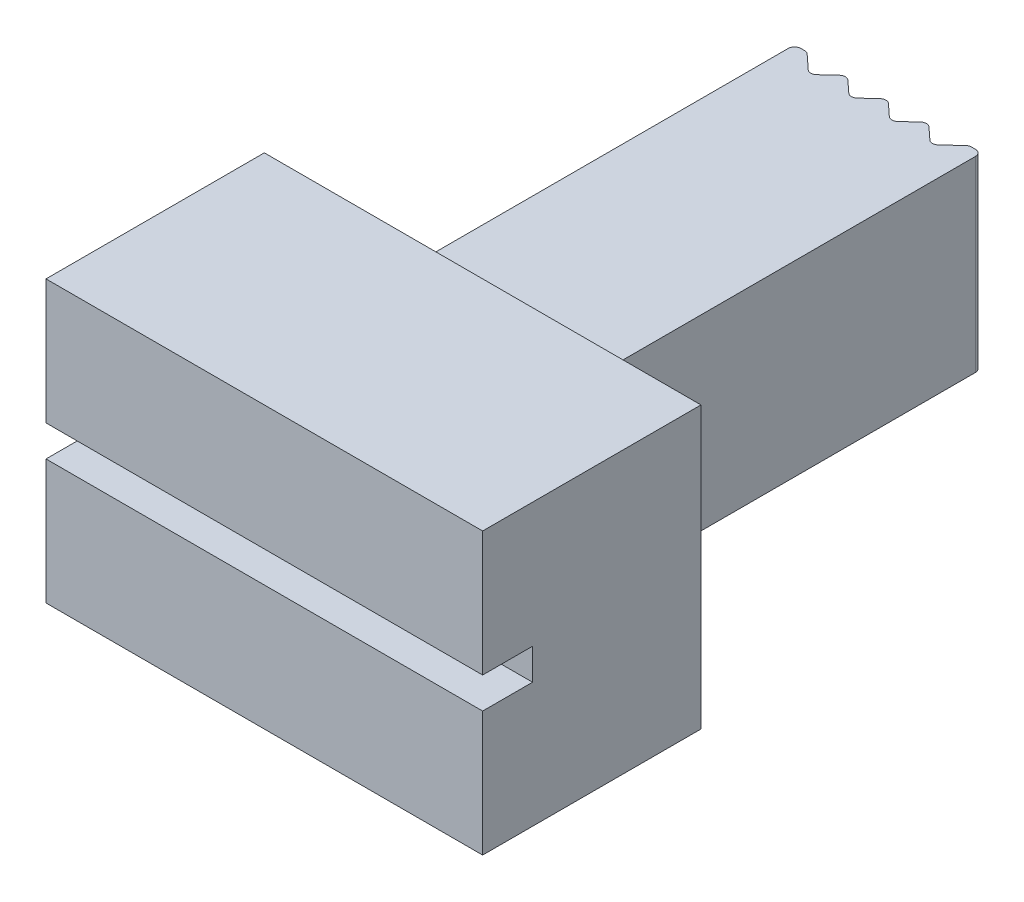
ISO-10303-21;
HEADER;
FILE_DESCRIPTION(('STEP AP214'),'2;1');
FILE_NAME('part.step','',(''),(''),'','','');
FILE_SCHEMA(('AUTOMOTIVE_DESIGN { 1 0 10303 214 1 1 1 1 }'));
ENDSEC;
DATA;
#1=APPLICATION_CONTEXT('core data for automotive mechanical design processes');
#2=APPLICATION_PROTOCOL_DEFINITION('international standard','automotive_design',2000,#1);
#3=PRODUCT_CONTEXT('',#1,'mechanical');
#4=PRODUCT('Part','Part','',(#3));
#5=PRODUCT_RELATED_PRODUCT_CATEGORY('part','',(#4));
#6=PRODUCT_DEFINITION_FORMATION('','',#4);
#7=PRODUCT_DEFINITION_CONTEXT('part definition',#1,'design');
#8=PRODUCT_DEFINITION('design','',#6,#7);
#9=PRODUCT_DEFINITION_SHAPE('','',#8);
#10=(LENGTH_UNIT() NAMED_UNIT(*) SI_UNIT(.MILLI.,.METRE.));
#11=(NAMED_UNIT(*) PLANE_ANGLE_UNIT() SI_UNIT($,.RADIAN.));
#12=(NAMED_UNIT(*) SI_UNIT($,.STERADIAN.) SOLID_ANGLE_UNIT());
#13=UNCERTAINTY_MEASURE_WITH_UNIT(LENGTH_MEASURE(1.E-05),#10,'distance_accuracy_value','');
#14=(GEOMETRIC_REPRESENTATION_CONTEXT(3) GLOBAL_UNCERTAINTY_ASSIGNED_CONTEXT((#13)) GLOBAL_UNIT_ASSIGNED_CONTEXT((#10,
#11,#12)) REPRESENTATION_CONTEXT('',''));
#15=CARTESIAN_POINT('',(0.,0.,0.));
#16=DIRECTION('',(0.,0.,1.));
#17=DIRECTION('',(1.,0.,0.));
#18=AXIS2_PLACEMENT_3D('',#15,#16,#17);
#19=CARTESIAN_POINT('',(0.,0.,-6.5));
#20=DIRECTION('',(0.,0.,-1.));
#21=DIRECTION('',(-1.,0.,0.));
#22=AXIS2_PLACEMENT_3D('',#19,#20,#21);
#23=PLANE('',#22);
#24=DIRECTION('',(-1.,0.,0.));
#25=VECTOR('',#24,1.);
#26=CARTESIAN_POINT('',(-1.5,-1.5,-6.5));
#27=LINE('',#26,#25);
#28=CARTESIAN_POINT('',(-1.33909838344129,-1.5,-6.5));
#29=VERTEX_POINT('',#28);
#30=CARTESIAN_POINT('',(-1.4,-1.5,-6.5));
#31=VERTEX_POINT('',#30);
#32=EDGE_CURVE('E296',#29,#31,#27,.T.);
#33=ORIENTED_EDGE('',*,*,#32,.T.);
#34=DIRECTION('',(0.,1.,0.));
#35=VECTOR('',#34,1.);
#36=CARTESIAN_POINT('',(-1.4,1.5,-6.5));
#37=LINE('',#36,#35);
#38=CARTESIAN_POINT('',(-1.4,1.5,-6.5));
#39=VERTEX_POINT('',#38);
#40=EDGE_CURVE('E393',#31,#39,#37,.T.);
#41=ORIENTED_EDGE('',*,*,#40,.T.);
#42=DIRECTION('',(1.,0.,0.));
#43=VECTOR('',#42,1.);
#44=CARTESIAN_POINT('',(-1.5,1.5,-6.5));
#45=LINE('',#44,#43);
#46=CARTESIAN_POINT('',(-1.33909838344128,1.5,-6.5));
#47=VERTEX_POINT('',#46);
#48=EDGE_CURVE('E301',#39,#47,#45,.T.);
#49=ORIENTED_EDGE('',*,*,#48,.T.);
#50=DIRECTION('',(0.,1.,0.));
#51=VECTOR('',#50,1.);
#52=CARTESIAN_POINT('',(-1.33909838344129,-1.5,-6.5));
#53=LINE('',#52,#51);
#54=EDGE_CURVE('E391',#47,#29,#53,.F.);
#55=ORIENTED_EDGE('',*,*,#54,.T.);
#56=EDGE_LOOP('',(#33,#41,#49,#55));
#57=FACE_BOUND('',#56,.T.);
#58=ADVANCED_FACE('F51',(#57),#23,.T.);
#59=CARTESIAN_POINT('',(0.,0.,3.5));
#60=DIRECTION('',(0.,0.,1.));
#61=DIRECTION('',(1.,0.,0.));
#62=AXIS2_PLACEMENT_3D('',#59,#60,#61);
#63=PLANE('',#62);
#64=DIRECTION('',(1.,0.,0.));
#65=VECTOR('',#64,1.);
#66=CARTESIAN_POINT('',(0.,-0.25,3.5));
#67=LINE('',#66,#65);
#68=CARTESIAN_POINT('',(-3.5,-0.25,3.5));
#69=VERTEX_POINT('',#68);
#70=CARTESIAN_POINT('',(3.5,-0.25,3.5));
#71=VERTEX_POINT('',#70);
#72=EDGE_CURVE('E355',#69,#71,#67,.T.);
#73=ORIENTED_EDGE('',*,*,#72,.F.);
#74=DIRECTION('',(0.,-1.,0.));
#75=VECTOR('',#74,1.);
#76=CARTESIAN_POINT('',(-3.5,-2.25,3.5));
#77=LINE('',#76,#75);
#78=CARTESIAN_POINT('',(-3.5,-2.25,3.5));
#79=VERTEX_POINT('',#78);
#80=EDGE_CURVE('E326',#69,#79,#77,.T.);
#81=ORIENTED_EDGE('',*,*,#80,.T.);
#82=DIRECTION('',(1.,0.,0.));
#83=VECTOR('',#82,1.);
#84=CARTESIAN_POINT('',(3.5,-2.25,3.5));
#85=LINE('',#84,#83);
#86=CARTESIAN_POINT('',(3.5,-2.25,3.5));
#87=VERTEX_POINT('',#86);
#88=EDGE_CURVE('E325',#79,#87,#85,.T.);
#89=ORIENTED_EDGE('',*,*,#88,.T.);
#90=DIRECTION('',(0.,1.,0.));
#91=VECTOR('',#90,1.);
#92=CARTESIAN_POINT('',(3.5,-2.25,3.5));
#93=LINE('',#92,#91);
#94=EDGE_CURVE('E329',#87,#71,#93,.T.);
#95=ORIENTED_EDGE('',*,*,#94,.T.);
#96=EDGE_LOOP('',(#73,#81,#89,#95));
#97=FACE_BOUND('',#96,.T.);
#98=ADVANCED_FACE('F574',(#97),#63,.T.);
#99=CARTESIAN_POINT('',(0.,0.,0.));
#100=DIRECTION('',(0.,0.,1.));
#101=DIRECTION('',(1.,0.,0.));
#102=AXIS2_PLACEMENT_3D('',#99,#100,#101);
#103=PLANE('',#102);
#104=DIRECTION('',(0.,-1.,0.));
#105=VECTOR('',#104,1.);
#106=CARTESIAN_POINT('',(-3.5,-2.25,0.));
#107=LINE('',#106,#105);
#108=CARTESIAN_POINT('',(-3.5,2.25,0.));
#109=VERTEX_POINT('',#108);
#110=CARTESIAN_POINT('',(-3.5,-2.25,0.));
#111=VERTEX_POINT('',#110);
#112=EDGE_CURVE('E322',#109,#111,#107,.T.);
#113=ORIENTED_EDGE('',*,*,#112,.F.);
#114=DIRECTION('',(-1.,0.,0.));
#115=VECTOR('',#114,1.);
#116=CARTESIAN_POINT('',(3.5,2.25,0.));
#117=LINE('',#116,#115);
#118=CARTESIAN_POINT('',(3.5,2.25,0.));
#119=VERTEX_POINT('',#118);
#120=EDGE_CURVE('E341',#119,#109,#117,.T.);
#121=ORIENTED_EDGE('',*,*,#120,.F.);
#122=DIRECTION('',(0.,1.,0.));
#123=VECTOR('',#122,1.);
#124=CARTESIAN_POINT('',(3.5,-2.25,0.));
#125=LINE('',#124,#123);
#126=CARTESIAN_POINT('',(3.5,-2.25,0.));
#127=VERTEX_POINT('',#126);
#128=EDGE_CURVE('E339',#127,#119,#125,.T.);
#129=ORIENTED_EDGE('',*,*,#128,.F.);
#130=DIRECTION('',(1.,0.,0.));
#131=VECTOR('',#130,1.);
#132=CARTESIAN_POINT('',(3.5,-2.25,0.));
#133=LINE('',#132,#131);
#134=EDGE_CURVE('E337',#111,#127,#133,.T.);
#135=ORIENTED_EDGE('',*,*,#134,.F.);
#136=EDGE_LOOP('',(#113,#121,#129,#135));
#137=FACE_BOUND('',#136,.T.);
#138=DIRECTION('',(0.,-1.,0.));
#139=VECTOR('',#138,1.);
#140=CARTESIAN_POINT('',(1.5,-1.5,0.));
#141=LINE('',#140,#139);
#142=CARTESIAN_POINT('',(1.5,1.5,0.));
#143=VERTEX_POINT('',#142);
#144=CARTESIAN_POINT('',(1.5,-1.5,0.));
#145=VERTEX_POINT('',#144);
#146=EDGE_CURVE('E294',#143,#145,#141,.T.);
#147=ORIENTED_EDGE('',*,*,#146,.F.);
#148=DIRECTION('',(1.,0.,0.));
#149=VECTOR('',#148,1.);
#150=CARTESIAN_POINT('',(-1.5,1.5,0.));
#151=LINE('',#150,#149);
#152=CARTESIAN_POINT('',(-1.5,1.5,0.));
#153=VERTEX_POINT('',#152);
#154=EDGE_CURVE('E300',#153,#143,#151,.T.);
#155=ORIENTED_EDGE('',*,*,#154,.F.);
#156=DIRECTION('',(0.,1.,0.));
#157=VECTOR('',#156,1.);
#158=CARTESIAN_POINT('',(-1.5,-1.5,0.));
#159=LINE('',#158,#157);
#160=CARTESIAN_POINT('',(-1.5,-1.5,0.));
#161=VERTEX_POINT('',#160);
#162=EDGE_CURVE('E310',#161,#153,#159,.T.);
#163=ORIENTED_EDGE('',*,*,#162,.F.);
#164=DIRECTION('',(-1.,0.,0.));
#165=VECTOR('',#164,1.);
#166=CARTESIAN_POINT('',(-1.5,-1.5,0.));
#167=LINE('',#166,#165);
#168=EDGE_CURVE('E307',#145,#161,#167,.T.);
#169=ORIENTED_EDGE('',*,*,#168,.F.);
#170=EDGE_LOOP('',(#147,#155,#163,#169));
#171=FACE_BOUND('',#170,.T.);
#172=ADVANCED_FACE('F549',(#137,#171),#103,.F.);
#173=CARTESIAN_POINT('',(-3.5,-2.25,3.5));
#174=DIRECTION('',(1.,0.,0.));
#175=DIRECTION('',(0.,0.,-1.));
#176=AXIS2_PLACEMENT_3D('',#173,#174,#175);
#177=PLANE('',#176);
#178=ORIENTED_EDGE('',*,*,#80,.F.);
#179=DIRECTION('',(0.,0.,-1.));
#180=VECTOR('',#179,1.);
#181=CARTESIAN_POINT('',(-3.5,-0.25,4.3));
#182=LINE('',#181,#180);
#183=CARTESIAN_POINT('',(-3.5,-0.25,2.7));
#184=VERTEX_POINT('',#183);
#185=EDGE_CURVE('E270',#69,#184,#182,.T.);
#186=ORIENTED_EDGE('',*,*,#185,.T.);
#187=DIRECTION('',(0.,1.,0.));
#188=VECTOR('',#187,1.);
#189=CARTESIAN_POINT('',(-3.5,-0.25,2.7));
#190=LINE('',#189,#188);
#191=CARTESIAN_POINT('',(-3.5,0.25,2.7));
#192=VERTEX_POINT('',#191);
#193=EDGE_CURVE('E263',#184,#192,#190,.T.);
#194=ORIENTED_EDGE('',*,*,#193,.T.);
#195=DIRECTION('',(0.,0.,1.));
#196=VECTOR('',#195,1.);
#197=CARTESIAN_POINT('',(-3.5,0.25,4.3));
#198=LINE('',#197,#196);
#199=CARTESIAN_POINT('',(-3.5,0.25,3.5));
#200=VERTEX_POINT('',#199);
#201=EDGE_CURVE('E273',#192,#200,#198,.T.);
#202=ORIENTED_EDGE('',*,*,#201,.T.);
#203=CARTESIAN_POINT('',(-3.5,2.25,3.5));
#204=VERTEX_POINT('',#203);
#205=EDGE_CURVE('E323',#204,#200,#77,.T.);
#206=ORIENTED_EDGE('',*,*,#205,.F.);
#207=DIRECTION('',(0.,0.,-1.));
#208=VECTOR('',#207,1.);
#209=CARTESIAN_POINT('',(-3.5,2.25,3.5));
#210=LINE('',#209,#208);
#211=EDGE_CURVE('E334',#204,#109,#210,.T.);
#212=ORIENTED_EDGE('',*,*,#211,.T.);
#213=ORIENTED_EDGE('',*,*,#112,.T.);
#214=DIRECTION('',(0.,0.,-1.));
#215=VECTOR('',#214,1.);
#216=CARTESIAN_POINT('',(-3.5,-2.25,3.5));
#217=LINE('',#216,#215);
#218=EDGE_CURVE('E351',#79,#111,#217,.T.);
#219=ORIENTED_EDGE('',*,*,#218,.F.);
#220=EDGE_LOOP('',(#178,#186,#194,#202,#206,#212,#213,#219));
#221=FACE_BOUND('',#220,.T.);
#222=ADVANCED_FACE('F282',(#221),#177,.F.);
#223=CARTESIAN_POINT('',(3.5,-2.25,3.5));
#224=DIRECTION('',(0.,1.,0.));
#225=DIRECTION('',(-1.,0.,0.));
#226=AXIS2_PLACEMENT_3D('',#223,#224,#225);
#227=PLANE('',#226);
#228=ORIENTED_EDGE('',*,*,#134,.T.);
#229=DIRECTION('',(0.,0.,-1.));
#230=VECTOR('',#229,1.);
#231=CARTESIAN_POINT('',(3.5,-2.25,3.5));
#232=LINE('',#231,#230);
#233=EDGE_CURVE('E348',#87,#127,#232,.T.);
#234=ORIENTED_EDGE('',*,*,#233,.F.);
#235=ORIENTED_EDGE('',*,*,#88,.F.);
#236=ORIENTED_EDGE('',*,*,#218,.T.);
#237=EDGE_LOOP('',(#228,#234,#235,#236));
#238=FACE_BOUND('',#237,.T.);
#239=ADVANCED_FACE('F611',(#238),#227,.F.);
#240=CARTESIAN_POINT('',(3.5,-2.25,3.5));
#241=DIRECTION('',(-1.,0.,0.));
#242=DIRECTION('',(0.,0.,1.));
#243=AXIS2_PLACEMENT_3D('',#240,#241,#242);
#244=PLANE('',#243);
#245=DIRECTION('',(0.,1.,0.));
#246=VECTOR('',#245,1.);
#247=CARTESIAN_POINT('',(3.5,-0.25,2.7));
#248=LINE('',#247,#246);
#249=CARTESIAN_POINT('',(3.5,-0.25,2.7));
#250=VERTEX_POINT('',#249);
#251=CARTESIAN_POINT('',(3.5,0.25,2.7));
#252=VERTEX_POINT('',#251);
#253=EDGE_CURVE('E266',#250,#252,#248,.T.);
#254=ORIENTED_EDGE('',*,*,#253,.F.);
#255=DIRECTION('',(0.,0.,-1.));
#256=VECTOR('',#255,1.);
#257=CARTESIAN_POINT('',(3.5,-0.25,4.3));
#258=LINE('',#257,#256);
#259=EDGE_CURVE('E283',#71,#250,#258,.T.);
#260=ORIENTED_EDGE('',*,*,#259,.F.);
#261=ORIENTED_EDGE('',*,*,#94,.F.);
#262=ORIENTED_EDGE('',*,*,#233,.T.);
#263=ORIENTED_EDGE('',*,*,#128,.T.);
#264=DIRECTION('',(0.,0.,-1.));
#265=VECTOR('',#264,1.);
#266=CARTESIAN_POINT('',(3.5,2.25,3.5));
#267=LINE('',#266,#265);
#268=CARTESIAN_POINT('',(3.5,2.25,3.5));
#269=VERTEX_POINT('',#268);
#270=EDGE_CURVE('E345',#269,#119,#267,.T.);
#271=ORIENTED_EDGE('',*,*,#270,.F.);
#272=CARTESIAN_POINT('',(3.5,0.25,3.5));
#273=VERTEX_POINT('',#272);
#274=EDGE_CURVE('E328',#273,#269,#93,.T.);
#275=ORIENTED_EDGE('',*,*,#274,.F.);
#276=DIRECTION('',(0.,0.,1.));
#277=VECTOR('',#276,1.);
#278=CARTESIAN_POINT('',(3.5,0.25,4.3));
#279=LINE('',#278,#277);
#280=EDGE_CURVE('E285',#252,#273,#279,.T.);
#281=ORIENTED_EDGE('',*,*,#280,.F.);
#282=EDGE_LOOP('',(#254,#260,#261,#262,#263,#271,#275,#281));
#283=FACE_BOUND('',#282,.T.);
#284=ADVANCED_FACE('F607',(#283),#244,.F.);
#285=CARTESIAN_POINT('',(3.5,2.25,3.5));
#286=DIRECTION('',(0.,-1.,0.));
#287=DIRECTION('',(1.,0.,0.));
#288=AXIS2_PLACEMENT_3D('',#285,#286,#287);
#289=PLANE('',#288);
#290=ORIENTED_EDGE('',*,*,#120,.T.);
#291=ORIENTED_EDGE('',*,*,#211,.F.);
#292=DIRECTION('',(-1.,0.,0.));
#293=VECTOR('',#292,1.);
#294=CARTESIAN_POINT('',(3.5,2.25,3.5));
#295=LINE('',#294,#293);
#296=EDGE_CURVE('E332',#269,#204,#295,.T.);
#297=ORIENTED_EDGE('',*,*,#296,.F.);
#298=ORIENTED_EDGE('',*,*,#270,.T.);
#299=EDGE_LOOP('',(#290,#291,#297,#298));
#300=FACE_BOUND('',#299,.T.);
#301=ADVANCED_FACE('F600',(#300),#289,.F.);
#302=DIRECTION('',(-1.,0.,0.));
#303=VECTOR('',#302,1.);
#304=CARTESIAN_POINT('',(0.,0.25,3.5));
#305=LINE('',#304,#303);
#306=EDGE_CURVE('E276',#273,#200,#305,.T.);
#307=ORIENTED_EDGE('',*,*,#306,.F.);
#308=ORIENTED_EDGE('',*,*,#274,.T.);
#309=ORIENTED_EDGE('',*,*,#296,.T.);
#310=ORIENTED_EDGE('',*,*,#205,.T.);
#311=EDGE_LOOP('',(#307,#308,#309,#310));
#312=FACE_BOUND('',#311,.T.);
#313=ADVANCED_FACE('F581',(#312),#63,.T.);
#314=CARTESIAN_POINT('',(1.5,-1.5,-6.5));
#315=DIRECTION('',(-1.,0.,0.));
#316=DIRECTION('',(0.,0.,1.));
#317=AXIS2_PLACEMENT_3D('',#314,#315,#316);
#318=PLANE('',#317);
#319=DIRECTION('',(0.,0.,1.));
#320=VECTOR('',#319,1.);
#321=CARTESIAN_POINT('',(1.5,-1.5,-6.5));
#322=LINE('',#321,#320);
#323=CARTESIAN_POINT('',(1.5,-1.5,-6.4));
#324=VERTEX_POINT('',#323);
#325=EDGE_CURVE('E320',#324,#145,#322,.T.);
#326=ORIENTED_EDGE('',*,*,#325,.F.);
#327=DIRECTION('',(0.,-1.,0.));
#328=VECTOR('',#327,1.);
#329=CARTESIAN_POINT('',(1.5,1.5,-6.4));
#330=LINE('',#329,#328);
#331=CARTESIAN_POINT('',(1.5,1.5,-6.4));
#332=VERTEX_POINT('',#331);
#333=EDGE_CURVE('E377',#324,#332,#330,.F.);
#334=ORIENTED_EDGE('',*,*,#333,.T.);
#335=DIRECTION('',(0.,0.,1.));
#336=VECTOR('',#335,1.);
#337=CARTESIAN_POINT('',(1.5,1.5,-6.5));
#338=LINE('',#337,#336);
#339=EDGE_CURVE('E303',#332,#143,#338,.T.);
#340=ORIENTED_EDGE('',*,*,#339,.T.);
#341=ORIENTED_EDGE('',*,*,#146,.T.);
#342=EDGE_LOOP('',(#326,#334,#340,#341));
#343=FACE_BOUND('',#342,.T.);
#344=ADVANCED_FACE('F545',(#343),#318,.F.);
#345=CARTESIAN_POINT('',(-1.5,-1.5,-6.5));
#346=DIRECTION('',(0.,1.,0.));
#347=DIRECTION('',(-1.,0.,0.));
#348=AXIS2_PLACEMENT_3D('',#345,#346,#347);
#349=PLANE('',#348);
#350=CARTESIAN_POINT('',(1.4,-1.5,-6.5));
#351=VERTEX_POINT('',#350);
#352=CARTESIAN_POINT('',(1.33909838344128,-1.5,-6.5));
#353=VERTEX_POINT('',#352);
#354=EDGE_CURVE('E299',#351,#353,#27,.T.);
#355=ORIENTED_EDGE('',*,*,#354,.F.);
#356=CARTESIAN_POINT('',(1.4,-1.5,-6.4));
#357=DIRECTION('',(0.,1.,0.));
#358=DIRECTION('',(-1.,0.,0.));
#359=AXIS2_PLACEMENT_3D('',#356,#357,#358);
#360=CIRCLE('',#359,0.1);
#361=EDGE_CURVE('E375',#351,#324,#360,.F.);
#362=ORIENTED_EDGE('',*,*,#361,.T.);
#363=ORIENTED_EDGE('',*,*,#325,.T.);
#364=ORIENTED_EDGE('',*,*,#168,.T.);
#365=DIRECTION('',(0.,0.,1.));
#366=VECTOR('',#365,1.);
#367=CARTESIAN_POINT('',(-1.5,-1.5,-6.5));
#368=LINE('',#367,#366);
#369=CARTESIAN_POINT('',(-1.5,-1.5,-6.4));
#370=VERTEX_POINT('',#369);
#371=EDGE_CURVE('E318',#370,#161,#368,.T.);
#372=ORIENTED_EDGE('',*,*,#371,.F.);
#373=CARTESIAN_POINT('',(-1.4,-1.5,-6.4));
#374=DIRECTION('',(0.,1.,0.));
#375=DIRECTION('',(-1.,0.,0.));
#376=AXIS2_PLACEMENT_3D('',#373,#374,#375);
#377=CIRCLE('',#376,0.1);
#378=EDGE_CURVE('E373',#370,#31,#377,.F.);
#379=ORIENTED_EDGE('',*,*,#378,.T.);
#380=ORIENTED_EDGE('',*,*,#32,.F.);
#381=CARTESIAN_POINT('',(-1.33909838344129,-1.5,-6.4));
#382=DIRECTION('',(0.,1.,0.));
#383=DIRECTION('',(-1.,0.,0.));
#384=AXIS2_PLACEMENT_3D('',#381,#382,#383);
#385=CIRCLE('',#384,0.1);
#386=CARTESIAN_POINT('',(-1.27127037316798,-1.5,-6.47348034446275));
#387=VERTEX_POINT('',#386);
#388=EDGE_CURVE('E371',#29,#387,#385,.F.);
#389=ORIENTED_EDGE('',*,*,#388,.T.);
#390=DIRECTION('',(0.734803444627488,0.,0.678280102733066));
#391=VECTOR('',#390,1.);
#392=CARTESIAN_POINT('',(-1.40798722044728,-1.5,-6.59968051118211));
#393=LINE('',#392,#391);
#394=CARTESIAN_POINT('',(-1.04282801027331,-1.5,-6.26261047102151));
#395=VERTEX_POINT('',#394);
#396=EDGE_CURVE('E288',#387,#395,#393,.T.);
#397=ORIENTED_EDGE('',*,*,#396,.T.);
#398=CARTESIAN_POINT('',(-0.975000000000002,-1.5,-6.33609081548426));
#399=DIRECTION('',(0.,1.,0.));
#400=DIRECTION('',(-1.,0.,0.));
#401=AXIS2_PLACEMENT_3D('',#398,#399,#400);
#402=CIRCLE('',#401,0.1);
#403=CARTESIAN_POINT('',(-0.907171989726695,-1.5,-6.26261047102151));
#404=VERTEX_POINT('',#403);
#405=EDGE_CURVE('E12',#395,#404,#402,.T.);
#406=ORIENTED_EDGE('',*,*,#405,.T.);
#407=DIRECTION('',(0.734803444627488,0.,-0.678280102733065));
#408=VECTOR('',#407,1.);
#409=CARTESIAN_POINT('',(-1.10894568690096,-1.5,-6.07635782747604));
#410=LINE('',#409,#408);
#411=CARTESIAN_POINT('',(-0.717828010273308,-1.5,-6.43738952897849));
#412=VERTEX_POINT('',#411);
#413=EDGE_CURVE('E472',#404,#412,#410,.T.);
#414=ORIENTED_EDGE('',*,*,#413,.T.);
#415=CARTESIAN_POINT('',(-0.650000000000001,-1.5,-6.36390918451574));
#416=DIRECTION('',(0.,1.,0.));
#417=DIRECTION('',(-1.,0.,0.));
#418=AXIS2_PLACEMENT_3D('',#415,#416,#417);
#419=CIRCLE('',#418,0.1);
#420=CARTESIAN_POINT('',(-0.582171989726694,-1.5,-6.43738952897849));
#421=VERTEX_POINT('',#420);
#422=EDGE_CURVE('E363',#412,#421,#419,.F.);
#423=ORIENTED_EDGE('',*,*,#422,.T.);
#424=DIRECTION('',(0.734803444627488,0.,0.678280102733066));
#425=VECTOR('',#424,1.);
#426=CARTESIAN_POINT('',(-1.10894568690096,-1.5,-6.92364217252396));
#427=LINE('',#426,#425);
#428=CARTESIAN_POINT('',(-0.392828010273307,-1.5,-6.26261047102151));
#429=VERTEX_POINT('',#428);
#430=EDGE_CURVE('E492',#421,#429,#427,.T.);
#431=ORIENTED_EDGE('',*,*,#430,.T.);
#432=CARTESIAN_POINT('',(-0.325000000000001,-1.5,-6.33609081548426));
#433=DIRECTION('',(0.,1.,0.));
#434=DIRECTION('',(-1.,0.,0.));
#435=AXIS2_PLACEMENT_3D('',#432,#433,#434);
#436=CIRCLE('',#435,0.1);
#437=CARTESIAN_POINT('',(-0.257171989726694,-1.5,-6.26261047102151));
#438=VERTEX_POINT('',#437);
#439=EDGE_CURVE('E448',#429,#438,#436,.T.);
#440=ORIENTED_EDGE('',*,*,#439,.T.);
#441=DIRECTION('',(0.734803444627488,0.,-0.678280102733066));
#442=VECTOR('',#441,1.);
#443=CARTESIAN_POINT('',(-0.809904153354633,-1.5,-5.75239616613419));
#444=LINE('',#443,#442);
#445=CARTESIAN_POINT('',(-0.0678280102733066,-1.5,-6.43738952897849));
#446=VERTEX_POINT('',#445);
#447=EDGE_CURVE('E488',#438,#446,#444,.T.);
#448=ORIENTED_EDGE('',*,*,#447,.T.);
#449=CARTESIAN_POINT('',(0.,-1.5,-6.36390918451574));
#450=DIRECTION('',(0.,1.,0.));
#451=DIRECTION('',(-1.,0.,0.));
#452=AXIS2_PLACEMENT_3D('',#449,#450,#451);
#453=CIRCLE('',#452,0.1);
#454=CARTESIAN_POINT('',(0.0678280102733062,-1.5,-6.43738952897849));
#455=VERTEX_POINT('',#454);
#456=EDGE_CURVE('E365',#446,#455,#453,.F.);
#457=ORIENTED_EDGE('',*,*,#456,.T.);
#458=DIRECTION('',(0.734803444627488,0.,0.678280102733065));
#459=VECTOR('',#458,1.);
#460=CARTESIAN_POINT('',(-0.809904153354633,-1.5,-7.24760383386581));
#461=LINE('',#460,#459);
#462=CARTESIAN_POINT('',(0.257171989726693,-1.5,-6.26261047102151));
#463=VERTEX_POINT('',#462);
#464=EDGE_CURVE('E476',#455,#463,#461,.T.);
#465=ORIENTED_EDGE('',*,*,#464,.T.);
#466=CARTESIAN_POINT('',(0.325,-1.5,-6.33609081548426));
#467=DIRECTION('',(0.,1.,0.));
#468=DIRECTION('',(-1.,0.,0.));
#469=AXIS2_PLACEMENT_3D('',#466,#467,#468);
#470=CIRCLE('',#469,0.1);
#471=CARTESIAN_POINT('',(0.392828010273307,-1.5,-6.26261047102151));
#472=VERTEX_POINT('',#471);
#473=EDGE_CURVE('E444',#463,#472,#470,.T.);
#474=ORIENTED_EDGE('',*,*,#473,.T.);
#475=DIRECTION('',(0.734803444627488,0.,-0.678280102733066));
#476=VECTOR('',#475,1.);
#477=CARTESIAN_POINT('',(-0.510862619808307,-1.5,-5.42843450479233));
#478=LINE('',#477,#476);
#479=CARTESIAN_POINT('',(0.582171989726693,-1.5,-6.43738952897849));
#480=VERTEX_POINT('',#479);
#481=EDGE_CURVE('E478',#472,#480,#478,.T.);
#482=ORIENTED_EDGE('',*,*,#481,.T.);
#483=CARTESIAN_POINT('',(0.65,-1.5,-6.36390918451574));
#484=DIRECTION('',(0.,1.,0.));
#485=DIRECTION('',(-1.,0.,0.));
#486=AXIS2_PLACEMENT_3D('',#483,#484,#485);
#487=CIRCLE('',#486,0.1);
#488=CARTESIAN_POINT('',(0.717828010273307,-1.5,-6.43738952897849));
#489=VERTEX_POINT('',#488);
#490=EDGE_CURVE('E367',#480,#489,#487,.F.);
#491=ORIENTED_EDGE('',*,*,#490,.T.);
#492=DIRECTION('',(0.734803444627488,0.,0.678280102733065));
#493=VECTOR('',#492,1.);
#494=CARTESIAN_POINT('',(-0.510862619808307,-1.5,-7.57156549520767));
#495=LINE('',#494,#493);
#496=CARTESIAN_POINT('',(0.907171989726693,-1.5,-6.26261047102151));
#497=VERTEX_POINT('',#496);
#498=EDGE_CURVE('E504',#489,#497,#495,.T.);
#499=ORIENTED_EDGE('',*,*,#498,.T.);
#500=CARTESIAN_POINT('',(0.975,-1.5,-6.33609081548426));
#501=DIRECTION('',(0.,1.,0.));
#502=DIRECTION('',(-1.,0.,0.));
#503=AXIS2_PLACEMENT_3D('',#500,#501,#502);
#504=CIRCLE('',#503,0.1);
#505=CARTESIAN_POINT('',(1.04282801027331,-1.5,-6.26261047102151));
#506=VERTEX_POINT('',#505);
#507=EDGE_CURVE('E440',#497,#506,#504,.T.);
#508=ORIENTED_EDGE('',*,*,#507,.T.);
#509=DIRECTION('',(0.734803444627488,0.,-0.678280102733065));
#510=VECTOR('',#509,1.);
#511=CARTESIAN_POINT('',(-0.211821086261982,-1.5,-5.10447284345048));
#512=LINE('',#511,#510);
#513=CARTESIAN_POINT('',(1.27127037316798,-1.5,-6.47348034446275));
#514=VERTEX_POINT('',#513);
#515=EDGE_CURVE('E501',#506,#514,#512,.T.);
#516=ORIENTED_EDGE('',*,*,#515,.T.);
#517=CARTESIAN_POINT('',(1.33909838344128,-1.5,-6.4));
#518=DIRECTION('',(0.,1.,0.));
#519=DIRECTION('',(-1.,0.,0.));
#520=AXIS2_PLACEMENT_3D('',#517,#518,#519);
#521=CIRCLE('',#520,0.1);
#522=EDGE_CURVE('E369',#514,#353,#521,.F.);
#523=ORIENTED_EDGE('',*,*,#522,.T.);
#524=EDGE_LOOP('',(#355,#362,#363,#364,#372,#379,#380,#389,#397,#406,#414,#423,#431,#440,#448,
#457,#465,#474,#482,#491,#499,#508,#516,#523));
#525=FACE_BOUND('',#524,.T.);
#526=ADVANCED_FACE('F471',(#525),#349,.F.);
#527=CARTESIAN_POINT('',(-1.5,-1.5,-6.5));
#528=DIRECTION('',(1.,0.,0.));
#529=DIRECTION('',(0.,0.,-1.));
#530=AXIS2_PLACEMENT_3D('',#527,#528,#529);
#531=PLANE('',#530);
#532=DIRECTION('',(0.,0.,1.));
#533=VECTOR('',#532,1.);
#534=CARTESIAN_POINT('',(-1.5,1.5,-6.5));
#535=LINE('',#534,#533);
#536=CARTESIAN_POINT('',(-1.5,1.5,-6.4));
#537=VERTEX_POINT('',#536);
#538=EDGE_CURVE('E316',#537,#153,#535,.T.);
#539=ORIENTED_EDGE('',*,*,#538,.F.);
#540=DIRECTION('',(0.,1.,0.));
#541=VECTOR('',#540,1.);
#542=CARTESIAN_POINT('',(-1.5,-1.5,-6.4));
#543=LINE('',#542,#541);
#544=EDGE_CURVE('E396',#537,#370,#543,.F.);
#545=ORIENTED_EDGE('',*,*,#544,.T.);
#546=ORIENTED_EDGE('',*,*,#371,.T.);
#547=ORIENTED_EDGE('',*,*,#162,.T.);
#548=EDGE_LOOP('',(#539,#545,#546,#547));
#549=FACE_BOUND('',#548,.T.);
#550=ADVANCED_FACE('F553',(#549),#531,.F.);
#551=CARTESIAN_POINT('',(-1.5,1.5,-6.5));
#552=DIRECTION('',(0.,-1.,0.));
#553=DIRECTION('',(1.,0.,0.));
#554=AXIS2_PLACEMENT_3D('',#551,#552,#553);
#555=PLANE('',#554);
#556=ORIENTED_EDGE('',*,*,#339,.F.);
#557=CARTESIAN_POINT('',(1.4,1.5,-6.4));
#558=DIRECTION('',(0.,-1.,0.));
#559=DIRECTION('',(1.,0.,0.));
#560=AXIS2_PLACEMENT_3D('',#557,#558,#559);
#561=CIRCLE('',#560,0.1);
#562=CARTESIAN_POINT('',(1.4,1.5,-6.5));
#563=VERTEX_POINT('',#562);
#564=EDGE_CURVE('E389',#332,#563,#561,.F.);
#565=ORIENTED_EDGE('',*,*,#564,.T.);
#566=CARTESIAN_POINT('',(1.33909838344128,1.5,-6.5));
#567=VERTEX_POINT('',#566);
#568=EDGE_CURVE('E304',#567,#563,#45,.T.);
#569=ORIENTED_EDGE('',*,*,#568,.F.);
#570=CARTESIAN_POINT('',(1.33909838344128,1.5,-6.4));
#571=DIRECTION('',(0.,-1.,0.));
#572=DIRECTION('',(1.,0.,0.));
#573=AXIS2_PLACEMENT_3D('',#570,#571,#572);
#574=CIRCLE('',#573,0.1);
#575=CARTESIAN_POINT('',(1.27127037316798,1.5,-6.47348034446275));
#576=VERTEX_POINT('',#575);
#577=EDGE_CURVE('E385',#567,#576,#574,.F.);
#578=ORIENTED_EDGE('',*,*,#577,.T.);
#579=DIRECTION('',(0.734803444627488,0.,-0.678280102733065));
#580=VECTOR('',#579,1.);
#581=CARTESIAN_POINT('',(-2.64153354632588,1.5,-2.86166134185304));
#582=LINE('',#581,#580);
#583=CARTESIAN_POINT('',(1.04282801027331,1.5,-6.26261047102151));
#584=VERTEX_POINT('',#583);
#585=EDGE_CURVE('E507',#584,#576,#582,.T.);
#586=ORIENTED_EDGE('',*,*,#585,.F.);
#587=CARTESIAN_POINT('',(0.975,1.5,-6.33609081548426));
#588=DIRECTION('',(0.,-1.,0.));
#589=DIRECTION('',(1.,0.,0.));
#590=AXIS2_PLACEMENT_3D('',#587,#588,#589);
#591=CIRCLE('',#590,0.1);
#592=CARTESIAN_POINT('',(0.907171989726693,1.5,-6.26261047102151));
#593=VERTEX_POINT('',#592);
#594=EDGE_CURVE('E438',#584,#593,#591,.T.);
#595=ORIENTED_EDGE('',*,*,#594,.T.);
#596=DIRECTION('',(0.734803444627488,0.,0.678280102733065));
#597=VECTOR('',#596,1.);
#598=CARTESIAN_POINT('',(3.53865814696486,1.5,-3.8335463258786));
#599=LINE('',#598,#597);
#600=CARTESIAN_POINT('',(0.717828010273307,1.5,-6.43738952897849));
#601=VERTEX_POINT('',#600);
#602=EDGE_CURVE('E510',#601,#593,#599,.T.);
#603=ORIENTED_EDGE('',*,*,#602,.F.);
#604=CARTESIAN_POINT('',(0.65,1.5,-6.36390918451574));
#605=DIRECTION('',(0.,-1.,0.));
#606=DIRECTION('',(1.,0.,0.));
#607=AXIS2_PLACEMENT_3D('',#604,#605,#606);
#608=CIRCLE('',#607,0.1);
#609=CARTESIAN_POINT('',(0.582171989726695,1.5,-6.43738952897849));
#610=VERTEX_POINT('',#609);
#611=EDGE_CURVE('E383',#601,#610,#608,.F.);
#612=ORIENTED_EDGE('',*,*,#611,.T.);
#613=DIRECTION('',(0.734803444627488,0.,-0.678280102733066));
#614=VECTOR('',#613,1.);
#615=CARTESIAN_POINT('',(-2.9405750798722,1.5,-3.18562300319489));
#616=LINE('',#615,#614);
#617=CARTESIAN_POINT('',(0.392828010273308,1.5,-6.26261047102151));
#618=VERTEX_POINT('',#617);
#619=EDGE_CURVE('E464',#618,#610,#616,.T.);
#620=ORIENTED_EDGE('',*,*,#619,.F.);
#621=CARTESIAN_POINT('',(0.325000000000001,1.5,-6.33609081548426));
#622=DIRECTION('',(0.,-1.,0.));
#623=DIRECTION('',(1.,0.,0.));
#624=AXIS2_PLACEMENT_3D('',#621,#622,#623);
#625=CIRCLE('',#624,0.1);
#626=CARTESIAN_POINT('',(0.257171989726695,1.5,-6.26261047102151));
#627=VERTEX_POINT('',#626);
#628=EDGE_CURVE('E442',#618,#627,#625,.T.);
#629=ORIENTED_EDGE('',*,*,#628,.T.);
#630=DIRECTION('',(0.734803444627488,0.,0.678280102733065));
#631=VECTOR('',#630,1.);
#632=CARTESIAN_POINT('',(3.23961661341853,1.5,-3.50958466453674));
#633=LINE('',#632,#631);
#634=CARTESIAN_POINT('',(0.0678280102733072,1.5,-6.43738952897849));
#635=VERTEX_POINT('',#634);
#636=EDGE_CURVE('E485',#635,#627,#633,.T.);
#637=ORIENTED_EDGE('',*,*,#636,.F.);
#638=CARTESIAN_POINT('',(0.,1.5,-6.36390918451574));
#639=DIRECTION('',(0.,-1.,0.));
#640=DIRECTION('',(1.,0.,0.));
#641=AXIS2_PLACEMENT_3D('',#638,#639,#640);
#642=CIRCLE('',#641,0.1);
#643=CARTESIAN_POINT('',(-0.0678280102733059,1.5,-6.43738952897849));
#644=VERTEX_POINT('',#643);
#645=EDGE_CURVE('E381',#635,#644,#642,.F.);
#646=ORIENTED_EDGE('',*,*,#645,.T.);
#647=DIRECTION('',(0.734803444627488,0.,-0.678280102733066));
#648=VECTOR('',#647,1.);
#649=CARTESIAN_POINT('',(-3.23961661341853,1.5,-3.50958466453674));
#650=LINE('',#649,#648);
#651=CARTESIAN_POINT('',(-0.257171989726693,1.5,-6.26261047102151));
#652=VERTEX_POINT('',#651);
#653=EDGE_CURVE('E495',#652,#644,#650,.T.);
#654=ORIENTED_EDGE('',*,*,#653,.F.);
#655=CARTESIAN_POINT('',(-0.325,1.5,-6.33609081548426));
#656=DIRECTION('',(0.,-1.,0.));
#657=DIRECTION('',(1.,0.,0.));
#658=AXIS2_PLACEMENT_3D('',#655,#656,#657);
#659=CIRCLE('',#658,0.1);
#660=CARTESIAN_POINT('',(-0.392828010273307,1.5,-6.26261047102151));
#661=VERTEX_POINT('',#660);
#662=EDGE_CURVE('E446',#652,#661,#659,.T.);
#663=ORIENTED_EDGE('',*,*,#662,.T.);
#664=DIRECTION('',(0.734803444627488,0.,0.678280102733066));
#665=VECTOR('',#664,1.);
#666=CARTESIAN_POINT('',(2.9405750798722,1.5,-3.18562300319489));
#667=LINE('',#666,#665);
#668=CARTESIAN_POINT('',(-0.582171989726694,1.5,-6.43738952897849));
#669=VERTEX_POINT('',#668);
#670=EDGE_CURVE('E498',#669,#661,#667,.T.);
#671=ORIENTED_EDGE('',*,*,#670,.F.);
#672=CARTESIAN_POINT('',(-0.65,1.5,-6.36390918451574));
#673=DIRECTION('',(0.,-1.,0.));
#674=DIRECTION('',(1.,0.,0.));
#675=AXIS2_PLACEMENT_3D('',#672,#673,#674);
#676=CIRCLE('',#675,0.1);
#677=CARTESIAN_POINT('',(-0.717828010273307,1.5,-6.43738952897849));
#678=VERTEX_POINT('',#677);
#679=EDGE_CURVE('E379',#669,#678,#676,.F.);
#680=ORIENTED_EDGE('',*,*,#679,.T.);
#681=DIRECTION('',(0.734803444627488,0.,-0.678280102733065));
#682=VECTOR('',#681,1.);
#683=CARTESIAN_POINT('',(-3.53865814696486,1.5,-3.8335463258786));
#684=LINE('',#683,#682);
#685=CARTESIAN_POINT('',(-0.907171989726694,1.5,-6.26261047102151));
#686=VERTEX_POINT('',#685);
#687=EDGE_CURVE('E455',#686,#678,#684,.T.);
#688=ORIENTED_EDGE('',*,*,#687,.F.);
#689=CARTESIAN_POINT('',(-0.975000000000001,1.5,-6.33609081548426));
#690=DIRECTION('',(0.,-1.,0.));
#691=DIRECTION('',(1.,0.,0.));
#692=AXIS2_PLACEMENT_3D('',#689,#690,#691);
#693=CIRCLE('',#692,0.1);
#694=CARTESIAN_POINT('',(-1.04282801027331,1.5,-6.26261047102151));
#695=VERTEX_POINT('',#694);
#696=EDGE_CURVE('E59',#686,#695,#693,.T.);
#697=ORIENTED_EDGE('',*,*,#696,.T.);
#698=DIRECTION('',(0.734803444627488,0.,0.678280102733066));
#699=VECTOR('',#698,1.);
#700=CARTESIAN_POINT('',(2.64153354632588,1.5,-2.86166134185304));
#701=LINE('',#700,#699);
#702=CARTESIAN_POINT('',(-1.27127037316798,1.5,-6.47348034446275));
#703=VERTEX_POINT('',#702);
#704=EDGE_CURVE('E453',#703,#695,#701,.T.);
#705=ORIENTED_EDGE('',*,*,#704,.F.);
#706=CARTESIAN_POINT('',(-1.33909838344128,1.5,-6.4));
#707=DIRECTION('',(0.,-1.,0.));
#708=DIRECTION('',(1.,0.,0.));
#709=AXIS2_PLACEMENT_3D('',#706,#707,#708);
#710=CIRCLE('',#709,0.1);
#711=EDGE_CURVE('E72',#703,#47,#710,.F.);
#712=ORIENTED_EDGE('',*,*,#711,.T.);
#713=ORIENTED_EDGE('',*,*,#48,.F.);
#714=CARTESIAN_POINT('',(-1.4,1.5,-6.4));
#715=DIRECTION('',(0.,-1.,0.));
#716=DIRECTION('',(1.,0.,0.));
#717=AXIS2_PLACEMENT_3D('',#714,#715,#716);
#718=CIRCLE('',#717,0.1);
#719=EDGE_CURVE('E66',#39,#537,#718,.F.);
#720=ORIENTED_EDGE('',*,*,#719,.T.);
#721=ORIENTED_EDGE('',*,*,#538,.T.);
#722=ORIENTED_EDGE('',*,*,#154,.T.);
#723=EDGE_LOOP('',(#556,#565,#569,#578,#586,#595,#603,#612,#620,#629,#637,#646,#654,#663,#671,
#680,#688,#697,#705,#712,#713,#720,#721,#722));
#724=FACE_BOUND('',#723,.T.);
#725=ADVANCED_FACE('F452',(#724),#555,.F.);
#726=ORIENTED_EDGE('',*,*,#568,.T.);
#727=DIRECTION('',(0.,-1.,0.));
#728=VECTOR('',#727,1.);
#729=CARTESIAN_POINT('',(1.4,-1.5,-6.5));
#730=LINE('',#729,#728);
#731=EDGE_CURVE('E360',#563,#351,#730,.T.);
#732=ORIENTED_EDGE('',*,*,#731,.T.);
#733=ORIENTED_EDGE('',*,*,#354,.T.);
#734=DIRECTION('',(0.,1.,0.));
#735=VECTOR('',#734,1.);
#736=CARTESIAN_POINT('',(1.33909838344128,1.5,-6.5));
#737=LINE('',#736,#735);
#738=EDGE_CURVE('E357',#353,#567,#737,.T.);
#739=ORIENTED_EDGE('',*,*,#738,.T.);
#740=EDGE_LOOP('',(#726,#732,#733,#739));
#741=FACE_BOUND('',#740,.T.);
#742=ADVANCED_FACE('F535',(#741),#23,.T.);
#743=CARTESIAN_POINT('',(-3.5,-0.25,2.7));
#744=DIRECTION('',(0.,0.,-1.));
#745=DIRECTION('',(-1.,0.,0.));
#746=AXIS2_PLACEMENT_3D('',#743,#744,#745);
#747=PLANE('',#746);
#748=ORIENTED_EDGE('',*,*,#253,.T.);
#749=DIRECTION('',(1.,0.,0.));
#750=VECTOR('',#749,1.);
#751=CARTESIAN_POINT('',(-3.5,0.25,2.7));
#752=LINE('',#751,#750);
#753=EDGE_CURVE('E258',#192,#252,#752,.T.);
#754=ORIENTED_EDGE('',*,*,#753,.F.);
#755=ORIENTED_EDGE('',*,*,#193,.F.);
#756=DIRECTION('',(1.,0.,0.));
#757=VECTOR('',#756,1.);
#758=CARTESIAN_POINT('',(-3.5,-0.25,2.7));
#759=LINE('',#758,#757);
#760=EDGE_CURVE('E269',#184,#250,#759,.T.);
#761=ORIENTED_EDGE('',*,*,#760,.T.);
#762=EDGE_LOOP('',(#748,#754,#755,#761));
#763=FACE_BOUND('',#762,.T.);
#764=ADVANCED_FACE('F260',(#763),#747,.F.);
#765=CARTESIAN_POINT('',(-3.5,-0.25,4.3));
#766=DIRECTION('',(0.,-1.,0.));
#767=DIRECTION('',(0.,0.,-1.));
#768=AXIS2_PLACEMENT_3D('',#765,#766,#767);
#769=PLANE('',#768);
#770=ORIENTED_EDGE('',*,*,#72,.T.);
#771=ORIENTED_EDGE('',*,*,#259,.T.);
#772=ORIENTED_EDGE('',*,*,#760,.F.);
#773=ORIENTED_EDGE('',*,*,#185,.F.);
#774=EDGE_LOOP('',(#770,#771,#772,#773));
#775=FACE_BOUND('',#774,.T.);
#776=ADVANCED_FACE('F589',(#775),#769,.F.);
#777=CARTESIAN_POINT('',(-3.5,0.25,4.3));
#778=DIRECTION('',(0.,1.,0.));
#779=DIRECTION('',(0.,0.,1.));
#780=AXIS2_PLACEMENT_3D('',#777,#778,#779);
#781=PLANE('',#780);
#782=ORIENTED_EDGE('',*,*,#306,.T.);
#783=ORIENTED_EDGE('',*,*,#201,.F.);
#784=ORIENTED_EDGE('',*,*,#753,.T.);
#785=ORIENTED_EDGE('',*,*,#280,.T.);
#786=EDGE_LOOP('',(#782,#783,#784,#785));
#787=FACE_BOUND('',#786,.T.);
#788=ADVANCED_FACE('F274',(#787),#781,.F.);
#789=CARTESIAN_POINT('',(3.23961661341853,-5.,-3.50958466453674));
#790=DIRECTION('',(-0.678280102733065,0.,0.734803444627488));
#791=DIRECTION('',(0.734803444627488,0.,0.678280102733065));
#792=AXIS2_PLACEMENT_3D('',#789,#790,#791);
#793=PLANE('',#792);
#794=ORIENTED_EDGE('',*,*,#636,.T.);
#795=DIRECTION('',(0.,1.,0.));
#796=VECTOR('',#795,1.);
#797=CARTESIAN_POINT('',(0.257171989726693,-1.5,-6.26261047102151));
#798=LINE('',#797,#796);
#799=EDGE_CURVE('E421',#627,#463,#798,.F.);
#800=ORIENTED_EDGE('',*,*,#799,.T.);
#801=ORIENTED_EDGE('',*,*,#464,.F.);
#802=DIRECTION('',(0.,1.,0.));
#803=VECTOR('',#802,1.);
#804=CARTESIAN_POINT('',(0.0678280102733059,-5.,-6.43738952897849));
#805=LINE('',#804,#803);
#806=EDGE_CURVE('E418',#455,#635,#805,.T.);
#807=ORIENTED_EDGE('',*,*,#806,.T.);
#808=EDGE_LOOP('',(#794,#800,#801,#807));
#809=FACE_BOUND('',#808,.T.);
#810=ADVANCED_FACE('F643',(#809),#793,.F.);
#811=CARTESIAN_POINT('',(-2.9405750798722,-5.,-3.18562300319489));
#812=DIRECTION('',(0.678280102733066,0.,0.734803444627488));
#813=DIRECTION('',(0.734803444627488,0.,-0.678280102733066));
#814=AXIS2_PLACEMENT_3D('',#811,#812,#813);
#815=PLANE('',#814);
#816=ORIENTED_EDGE('',*,*,#619,.T.);
#817=DIRECTION('',(0.,-1.,0.));
#818=VECTOR('',#817,1.);
#819=CARTESIAN_POINT('',(0.582171989726693,-5.,-6.43738952897849));
#820=LINE('',#819,#818);
#821=EDGE_CURVE('E415',#610,#480,#820,.T.);
#822=ORIENTED_EDGE('',*,*,#821,.T.);
#823=ORIENTED_EDGE('',*,*,#481,.F.);
#824=DIRECTION('',(0.,1.,0.));
#825=VECTOR('',#824,1.);
#826=CARTESIAN_POINT('',(0.392828010273307,1.5,-6.26261047102151));
#827=LINE('',#826,#825);
#828=EDGE_CURVE('E412',#472,#618,#827,.T.);
#829=ORIENTED_EDGE('',*,*,#828,.T.);
#830=EDGE_LOOP('',(#816,#822,#823,#829));
#831=FACE_BOUND('',#830,.T.);
#832=ADVANCED_FACE('F640',(#831),#815,.F.);
#833=CARTESIAN_POINT('',(2.64153354632588,-5.,-2.86166134185304));
#834=DIRECTION('',(-0.678280102733066,0.,0.734803444627488));
#835=DIRECTION('',(0.734803444627488,0.,0.678280102733066));
#836=AXIS2_PLACEMENT_3D('',#833,#834,#835);
#837=PLANE('',#836);
#838=ORIENTED_EDGE('',*,*,#396,.F.);
#839=DIRECTION('',(0.,1.,0.));
#840=VECTOR('',#839,1.);
#841=CARTESIAN_POINT('',(-1.27127037316798,1.5,-6.47348034446275));
#842=LINE('',#841,#840);
#843=EDGE_CURVE('E400',#387,#703,#842,.T.);
#844=ORIENTED_EDGE('',*,*,#843,.T.);
#845=ORIENTED_EDGE('',*,*,#704,.T.);
#846=DIRECTION('',(0.,1.,0.));
#847=VECTOR('',#846,1.);
#848=CARTESIAN_POINT('',(-1.04282801027331,-1.5,-6.26261047102151));
#849=LINE('',#848,#847);
#850=EDGE_CURVE('E398',#695,#395,#849,.F.);
#851=ORIENTED_EDGE('',*,*,#850,.T.);
#852=EDGE_LOOP('',(#838,#844,#845,#851));
#853=FACE_BOUND('',#852,.T.);
#854=ADVANCED_FACE('F461',(#853),#837,.F.);
#855=CARTESIAN_POINT('',(-3.53865814696486,-5.,-3.8335463258786));
#856=DIRECTION('',(0.678280102733065,0.,0.734803444627488));
#857=DIRECTION('',(0.734803444627488,0.,-0.678280102733065));
#858=AXIS2_PLACEMENT_3D('',#855,#856,#857);
#859=PLANE('',#858);
#860=ORIENTED_EDGE('',*,*,#687,.T.);
#861=DIRECTION('',(0.,-1.,0.));
#862=VECTOR('',#861,1.);
#863=CARTESIAN_POINT('',(-0.717828010273308,-5.,-6.43738952897849));
#864=LINE('',#863,#862);
#865=EDGE_CURVE('E435',#678,#412,#864,.T.);
#866=ORIENTED_EDGE('',*,*,#865,.T.);
#867=ORIENTED_EDGE('',*,*,#413,.F.);
#868=DIRECTION('',(0.,1.,0.));
#869=VECTOR('',#868,1.);
#870=CARTESIAN_POINT('',(-0.907171989726694,1.5,-6.26261047102151));
#871=LINE('',#870,#869);
#872=EDGE_CURVE('E432',#404,#686,#871,.T.);
#873=ORIENTED_EDGE('',*,*,#872,.T.);
#874=EDGE_LOOP('',(#860,#866,#867,#873));
#875=FACE_BOUND('',#874,.T.);
#876=ADVANCED_FACE('F474',(#875),#859,.F.);
#877=CARTESIAN_POINT('',(-3.23961661341853,-5.,-3.50958466453674));
#878=DIRECTION('',(0.678280102733066,0.,0.734803444627488));
#879=DIRECTION('',(0.734803444627488,0.,-0.678280102733066));
#880=AXIS2_PLACEMENT_3D('',#877,#878,#879);
#881=PLANE('',#880);
#882=ORIENTED_EDGE('',*,*,#653,.T.);
#883=DIRECTION('',(0.,1.,0.));
#884=VECTOR('',#883,1.);
#885=CARTESIAN_POINT('',(-0.0678280102733076,-5.,-6.43738952897849));
#886=LINE('',#885,#884);
#887=EDGE_CURVE('E426',#644,#446,#886,.F.);
#888=ORIENTED_EDGE('',*,*,#887,.T.);
#889=ORIENTED_EDGE('',*,*,#447,.F.);
#890=DIRECTION('',(0.,1.,0.));
#891=VECTOR('',#890,1.);
#892=CARTESIAN_POINT('',(-0.257171989726693,1.5,-6.26261047102151));
#893=LINE('',#892,#891);
#894=EDGE_CURVE('E423',#438,#652,#893,.T.);
#895=ORIENTED_EDGE('',*,*,#894,.T.);
#896=EDGE_LOOP('',(#882,#888,#889,#895));
#897=FACE_BOUND('',#896,.T.);
#898=ADVANCED_FACE('F629',(#897),#881,.F.);
#899=CARTESIAN_POINT('',(2.9405750798722,-5.,-3.18562300319489));
#900=DIRECTION('',(-0.678280102733066,0.,0.734803444627488));
#901=DIRECTION('',(0.734803444627488,0.,0.678280102733066));
#902=AXIS2_PLACEMENT_3D('',#899,#900,#901);
#903=PLANE('',#902);
#904=ORIENTED_EDGE('',*,*,#670,.T.);
#905=DIRECTION('',(0.,1.,0.));
#906=VECTOR('',#905,1.);
#907=CARTESIAN_POINT('',(-0.392828010273307,-1.5,-6.26261047102151));
#908=LINE('',#907,#906);
#909=EDGE_CURVE('E430',#661,#429,#908,.F.);
#910=ORIENTED_EDGE('',*,*,#909,.T.);
#911=ORIENTED_EDGE('',*,*,#430,.F.);
#912=DIRECTION('',(0.,-1.,0.));
#913=VECTOR('',#912,1.);
#914=CARTESIAN_POINT('',(-0.582171989726695,-5.,-6.43738952897849));
#915=LINE('',#914,#913);
#916=EDGE_CURVE('E428',#421,#669,#915,.F.);
#917=ORIENTED_EDGE('',*,*,#916,.T.);
#918=EDGE_LOOP('',(#904,#910,#911,#917));
#919=FACE_BOUND('',#918,.T.);
#920=ADVANCED_FACE('F626',(#919),#903,.F.);
#921=CARTESIAN_POINT('',(-2.64153354632588,-5.,-2.86166134185304));
#922=DIRECTION('',(0.678280102733065,0.,0.734803444627488));
#923=DIRECTION('',(0.734803444627488,0.,-0.678280102733065));
#924=AXIS2_PLACEMENT_3D('',#921,#922,#923);
#925=PLANE('',#924);
#926=ORIENTED_EDGE('',*,*,#585,.T.);
#927=DIRECTION('',(0.,1.,0.));
#928=VECTOR('',#927,1.);
#929=CARTESIAN_POINT('',(1.27127037316798,-1.5,-6.47348034446275));
#930=LINE('',#929,#928);
#931=EDGE_CURVE('E406',#576,#514,#930,.F.);
#932=ORIENTED_EDGE('',*,*,#931,.T.);
#933=ORIENTED_EDGE('',*,*,#515,.F.);
#934=DIRECTION('',(0.,1.,0.));
#935=VECTOR('',#934,1.);
#936=CARTESIAN_POINT('',(1.04282801027331,1.5,-6.26261047102151));
#937=LINE('',#936,#935);
#938=EDGE_CURVE('E403',#506,#584,#937,.T.);
#939=ORIENTED_EDGE('',*,*,#938,.T.);
#940=EDGE_LOOP('',(#926,#932,#933,#939));
#941=FACE_BOUND('',#940,.T.);
#942=ADVANCED_FACE('F526',(#941),#925,.F.);
#943=CARTESIAN_POINT('',(3.53865814696485,-5.,-3.8335463258786));
#944=DIRECTION('',(-0.678280102733065,0.,0.734803444627488));
#945=DIRECTION('',(0.734803444627488,0.,0.678280102733065));
#946=AXIS2_PLACEMENT_3D('',#943,#944,#945);
#947=PLANE('',#946);
#948=ORIENTED_EDGE('',*,*,#602,.T.);
#949=DIRECTION('',(0.,1.,0.));
#950=VECTOR('',#949,1.);
#951=CARTESIAN_POINT('',(0.907171989726693,-1.5,-6.26261047102151));
#952=LINE('',#951,#950);
#953=EDGE_CURVE('E410',#593,#497,#952,.F.);
#954=ORIENTED_EDGE('',*,*,#953,.T.);
#955=ORIENTED_EDGE('',*,*,#498,.F.);
#956=DIRECTION('',(0.,-1.,0.));
#957=VECTOR('',#956,1.);
#958=CARTESIAN_POINT('',(0.717828010273306,-5.,-6.43738952897849));
#959=LINE('',#958,#957);
#960=EDGE_CURVE('E408',#489,#601,#959,.F.);
#961=ORIENTED_EDGE('',*,*,#960,.T.);
#962=EDGE_LOOP('',(#948,#954,#955,#961));
#963=FACE_BOUND('',#962,.T.);
#964=ADVANCED_FACE('F515',(#963),#947,.F.);
#965=CARTESIAN_POINT('',(1.4,0.,-6.4));
#966=DIRECTION('',(0.,1.,0.));
#967=DIRECTION('',(0.,0.,1.));
#968=AXIS2_PLACEMENT_3D('',#965,#966,#967);
#969=CYLINDRICAL_SURFACE('',#968,0.1);
#970=ORIENTED_EDGE('',*,*,#564,.F.);
#971=ORIENTED_EDGE('',*,*,#333,.F.);
#972=ORIENTED_EDGE('',*,*,#361,.F.);
#973=ORIENTED_EDGE('',*,*,#731,.F.);
#974=EDGE_LOOP('',(#970,#971,#972,#973));
#975=FACE_BOUND('',#974,.T.);
#976=ADVANCED_FACE('F540',(#975),#969,.T.);
#977=CARTESIAN_POINT('',(-1.4,0.,-6.4));
#978=DIRECTION('',(0.,-1.,0.));
#979=DIRECTION('',(0.,0.,-1.));
#980=AXIS2_PLACEMENT_3D('',#977,#978,#979);
#981=CYLINDRICAL_SURFACE('',#980,0.1);
#982=ORIENTED_EDGE('',*,*,#378,.F.);
#983=ORIENTED_EDGE('',*,*,#544,.F.);
#984=ORIENTED_EDGE('',*,*,#719,.F.);
#985=ORIENTED_EDGE('',*,*,#40,.F.);
#986=EDGE_LOOP('',(#982,#983,#984,#985));
#987=FACE_BOUND('',#986,.T.);
#988=ADVANCED_FACE('F557',(#987),#981,.T.);
#989=CARTESIAN_POINT('',(-1.33909838344129,-5.,-6.4));
#990=DIRECTION('',(0.,-1.,0.));
#991=DIRECTION('',(1.,0.,0.));
#992=AXIS2_PLACEMENT_3D('',#989,#990,#991);
#993=CYLINDRICAL_SURFACE('',#992,0.1);
#994=ORIENTED_EDGE('',*,*,#388,.F.);
#995=ORIENTED_EDGE('',*,*,#54,.F.);
#996=ORIENTED_EDGE('',*,*,#711,.F.);
#997=ORIENTED_EDGE('',*,*,#843,.F.);
#998=EDGE_LOOP('',(#994,#995,#996,#997));
#999=FACE_BOUND('',#998,.T.);
#1000=ADVANCED_FACE('F564',(#999),#993,.T.);
#1001=CARTESIAN_POINT('',(1.33909838344128,0.,-6.4));
#1002=DIRECTION('',(0.,-1.,0.));
#1003=DIRECTION('',(1.,0.,0.));
#1004=AXIS2_PLACEMENT_3D('',#1001,#1002,#1003);
#1005=CYLINDRICAL_SURFACE('',#1004,0.1);
#1006=ORIENTED_EDGE('',*,*,#522,.F.);
#1007=ORIENTED_EDGE('',*,*,#931,.F.);
#1008=ORIENTED_EDGE('',*,*,#577,.F.);
#1009=ORIENTED_EDGE('',*,*,#738,.F.);
#1010=EDGE_LOOP('',(#1006,#1007,#1008,#1009));
#1011=FACE_BOUND('',#1010,.T.);
#1012=ADVANCED_FACE('F530',(#1011),#1005,.T.);
#1013=CARTESIAN_POINT('',(0.974999999999999,-5.,-6.33609081548426));
#1014=DIRECTION('',(0.,-1.,0.));
#1015=DIRECTION('',(1.,0.,0.));
#1016=AXIS2_PLACEMENT_3D('',#1013,#1014,#1015);
#1017=CYLINDRICAL_SURFACE('',#1016,0.1);
#1018=ORIENTED_EDGE('',*,*,#507,.F.);
#1019=ORIENTED_EDGE('',*,*,#953,.F.);
#1020=ORIENTED_EDGE('',*,*,#594,.F.);
#1021=ORIENTED_EDGE('',*,*,#938,.F.);
#1022=EDGE_LOOP('',(#1018,#1019,#1020,#1021));
#1023=FACE_BOUND('',#1022,.T.);
#1024=ADVANCED_FACE('F521',(#1023),#1017,.F.);
#1025=CARTESIAN_POINT('',(0.649999999999999,-5.,-6.36390918451574));
#1026=DIRECTION('',(0.,-1.,0.));
#1027=DIRECTION('',(1.,0.,0.));
#1028=AXIS2_PLACEMENT_3D('',#1025,#1026,#1027);
#1029=CYLINDRICAL_SURFACE('',#1028,0.1);
#1030=ORIENTED_EDGE('',*,*,#611,.F.);
#1031=ORIENTED_EDGE('',*,*,#960,.F.);
#1032=ORIENTED_EDGE('',*,*,#490,.F.);
#1033=ORIENTED_EDGE('',*,*,#821,.F.);
#1034=EDGE_LOOP('',(#1030,#1031,#1032,#1033));
#1035=FACE_BOUND('',#1034,.T.);
#1036=ADVANCED_FACE('F717',(#1035),#1029,.T.);
#1037=CARTESIAN_POINT('',(0.324999999999999,-5.,-6.33609081548426));
#1038=DIRECTION('',(0.,-1.,0.));
#1039=DIRECTION('',(1.,0.,0.));
#1040=AXIS2_PLACEMENT_3D('',#1037,#1038,#1039);
#1041=CYLINDRICAL_SURFACE('',#1040,0.1);
#1042=ORIENTED_EDGE('',*,*,#473,.F.);
#1043=ORIENTED_EDGE('',*,*,#799,.F.);
#1044=ORIENTED_EDGE('',*,*,#628,.F.);
#1045=ORIENTED_EDGE('',*,*,#828,.F.);
#1046=EDGE_LOOP('',(#1042,#1043,#1044,#1045));
#1047=FACE_BOUND('',#1046,.T.);
#1048=ADVANCED_FACE('F726',(#1047),#1041,.F.);
#1049=CARTESIAN_POINT('',(0.,-5.,-6.36390918451574));
#1050=DIRECTION('',(0.,1.,0.));
#1051=DIRECTION('',(-1.,0.,0.));
#1052=AXIS2_PLACEMENT_3D('',#1049,#1050,#1051);
#1053=CYLINDRICAL_SURFACE('',#1052,0.1);
#1054=ORIENTED_EDGE('',*,*,#456,.F.);
#1055=ORIENTED_EDGE('',*,*,#887,.F.);
#1056=ORIENTED_EDGE('',*,*,#645,.F.);
#1057=ORIENTED_EDGE('',*,*,#806,.F.);
#1058=EDGE_LOOP('',(#1054,#1055,#1056,#1057));
#1059=FACE_BOUND('',#1058,.T.);
#1060=ADVANCED_FACE('F736',(#1059),#1053,.T.);
#1061=CARTESIAN_POINT('',(-0.325000000000002,-5.,-6.33609081548426));
#1062=DIRECTION('',(0.,-1.,0.));
#1063=DIRECTION('',(1.,0.,0.));
#1064=AXIS2_PLACEMENT_3D('',#1061,#1062,#1063);
#1065=CYLINDRICAL_SURFACE('',#1064,0.1);
#1066=ORIENTED_EDGE('',*,*,#439,.F.);
#1067=ORIENTED_EDGE('',*,*,#909,.F.);
#1068=ORIENTED_EDGE('',*,*,#662,.F.);
#1069=ORIENTED_EDGE('',*,*,#894,.F.);
#1070=EDGE_LOOP('',(#1066,#1067,#1068,#1069));
#1071=FACE_BOUND('',#1070,.T.);
#1072=ADVANCED_FACE('F746',(#1071),#1065,.F.);
#1073=CARTESIAN_POINT('',(-0.650000000000002,-5.,-6.36390918451574));
#1074=DIRECTION('',(0.,-1.,0.));
#1075=DIRECTION('',(1.,0.,0.));
#1076=AXIS2_PLACEMENT_3D('',#1073,#1074,#1075);
#1077=CYLINDRICAL_SURFACE('',#1076,0.1);
#1078=ORIENTED_EDGE('',*,*,#679,.F.);
#1079=ORIENTED_EDGE('',*,*,#916,.F.);
#1080=ORIENTED_EDGE('',*,*,#422,.F.);
#1081=ORIENTED_EDGE('',*,*,#865,.F.);
#1082=EDGE_LOOP('',(#1078,#1079,#1080,#1081));
#1083=FACE_BOUND('',#1082,.T.);
#1084=ADVANCED_FACE('F756',(#1083),#1077,.T.);
#1085=CARTESIAN_POINT('',(-0.975000000000002,-5.,-6.33609081548426));
#1086=DIRECTION('',(0.,-1.,0.));
#1087=DIRECTION('',(1.,0.,0.));
#1088=AXIS2_PLACEMENT_3D('',#1085,#1086,#1087);
#1089=CYLINDRICAL_SURFACE('',#1088,0.1);
#1090=ORIENTED_EDGE('',*,*,#405,.F.);
#1091=ORIENTED_EDGE('',*,*,#850,.F.);
#1092=ORIENTED_EDGE('',*,*,#696,.F.);
#1093=ORIENTED_EDGE('',*,*,#872,.F.);
#1094=EDGE_LOOP('',(#1090,#1091,#1092,#1093));
#1095=FACE_BOUND('',#1094,.T.);
#1096=ADVANCED_FACE('F53',(#1095),#1089,.F.);
#1097=CLOSED_SHELL('',(#58,#98,#172,#222,#239,#284,#301,#313,#344,#526,#550,#725,#742,#764,#776,
#788,#810,#832,#854,#876,#898,#920,#942,#964,#976,#988,#1000,#1012,#1024,#1036,#1048,#1060,
#1072,#1084,#1096));
#1098=MANIFOLD_SOLID_BREP('B2',#1097);
#1099=ADVANCED_BREP_SHAPE_REPRESENTATION('',(#18,#1098),#14);
#1100=SHAPE_DEFINITION_REPRESENTATION(#9,#1099);
ENDSEC;
END-ISO-10303-21;
